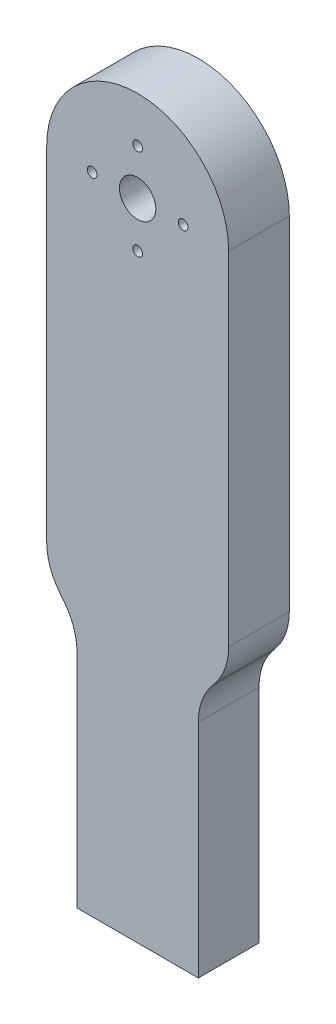
ISO-10303-21;
HEADER;
FILE_DESCRIPTION(('STEP AP214'),'2;1');
FILE_NAME('part.step','',(''),(''),'','','');
FILE_SCHEMA(('AUTOMOTIVE_DESIGN { 1 0 10303 214 1 1 1 1 }'));
ENDSEC;
DATA;
#1=APPLICATION_CONTEXT('core data for automotive mechanical design processes');
#2=APPLICATION_PROTOCOL_DEFINITION('international standard','automotive_design',2000,#1);
#3=PRODUCT_CONTEXT('',#1,'mechanical');
#4=PRODUCT('Part','Part','',(#3));
#5=PRODUCT_RELATED_PRODUCT_CATEGORY('part','',(#4));
#6=PRODUCT_DEFINITION_FORMATION('','',#4);
#7=PRODUCT_DEFINITION_CONTEXT('part definition',#1,'design');
#8=PRODUCT_DEFINITION('design','',#6,#7);
#9=PRODUCT_DEFINITION_SHAPE('','',#8);
#10=(LENGTH_UNIT() NAMED_UNIT(*) SI_UNIT(.MILLI.,.METRE.));
#11=(NAMED_UNIT(*) PLANE_ANGLE_UNIT() SI_UNIT($,.RADIAN.));
#12=(NAMED_UNIT(*) SI_UNIT($,.STERADIAN.) SOLID_ANGLE_UNIT());
#13=UNCERTAINTY_MEASURE_WITH_UNIT(LENGTH_MEASURE(1.E-05),#10,'distance_accuracy_value','');
#14=(GEOMETRIC_REPRESENTATION_CONTEXT(3) GLOBAL_UNCERTAINTY_ASSIGNED_CONTEXT((#13)) GLOBAL_UNIT_ASSIGNED_CONTEXT((#10,
#11,#12)) REPRESENTATION_CONTEXT('',''));
#15=CARTESIAN_POINT('',(0.,0.,0.));
#16=DIRECTION('',(0.,0.,1.));
#17=DIRECTION('',(1.,0.,0.));
#18=AXIS2_PLACEMENT_3D('',#15,#16,#17);
#19=CARTESIAN_POINT('',(15.,0.,5.));
#20=DIRECTION('',(1.,0.,0.));
#21=DIRECTION('',(0.,1.,0.));
#22=AXIS2_PLACEMENT_3D('',#19,#20,#21);
#23=PLANE('',#22);
#24=DIRECTION('',(0.,-1.,0.));
#25=VECTOR('',#24,1.);
#26=CARTESIAN_POINT('',(15.,0.,-5.));
#27=LINE('',#26,#25);
#28=CARTESIAN_POINT('',(15.,13.5,-5.));
#29=VERTEX_POINT('',#28);
#30=CARTESIAN_POINT('',(15.,-43.0102565672326,-5.));
#31=VERTEX_POINT('',#30);
#32=EDGE_CURVE('E187',#29,#31,#27,.T.);
#33=ORIENTED_EDGE('',*,*,#32,.F.);
#34=DIRECTION('',(0.,0.,-1.));
#35=VECTOR('',#34,1.);
#36=CARTESIAN_POINT('',(15.,13.5,5.));
#37=LINE('',#36,#35);
#38=CARTESIAN_POINT('',(15.,13.5,5.));
#39=VERTEX_POINT('',#38);
#40=EDGE_CURVE('E11',#39,#29,#37,.T.);
#41=ORIENTED_EDGE('',*,*,#40,.F.);
#42=DIRECTION('',(0.,-1.,0.));
#43=VECTOR('',#42,1.);
#44=CARTESIAN_POINT('',(15.,0.,5.));
#45=LINE('',#44,#43);
#46=CARTESIAN_POINT('',(15.,-43.0102565672326,5.));
#47=VERTEX_POINT('',#46);
#48=EDGE_CURVE('E527',#39,#47,#45,.T.);
#49=ORIENTED_EDGE('',*,*,#48,.T.);
#50=DIRECTION('',(0.,0.,-1.));
#51=VECTOR('',#50,1.);
#52=CARTESIAN_POINT('',(15.,-43.0102565672326,5.));
#53=LINE('',#52,#51);
#54=EDGE_CURVE('E63',#47,#31,#53,.T.);
#55=ORIENTED_EDGE('',*,*,#54,.T.);
#56=EDGE_LOOP('',(#33,#41,#49,#55));
#57=FACE_BOUND('',#56,.T.);
#58=ADVANCED_FACE('F45',(#57),#23,.T.);
#59=CARTESIAN_POINT('',(0.,13.5,5.));
#60=DIRECTION('',(0.,0.,-1.));
#61=DIRECTION('',(-1.,0.,0.));
#62=AXIS2_PLACEMENT_3D('',#59,#60,#61);
#63=CYLINDRICAL_SURFACE('',#62,15.);
#64=CARTESIAN_POINT('',(0.,13.5,-5.));
#65=DIRECTION('',(0.,0.,1.));
#66=DIRECTION('',(1.,0.,0.));
#67=AXIS2_PLACEMENT_3D('',#64,#65,#66);
#68=CIRCLE('',#67,15.);
#69=CARTESIAN_POINT('',(-15.,13.5,-5.));
#70=VERTEX_POINT('',#69);
#71=EDGE_CURVE('E190',#70,#29,#68,.F.);
#72=ORIENTED_EDGE('',*,*,#71,.F.);
#73=DIRECTION('',(0.,0.,-1.));
#74=VECTOR('',#73,1.);
#75=CARTESIAN_POINT('',(-15.,13.5,5.));
#76=LINE('',#75,#74);
#77=CARTESIAN_POINT('',(-15.,13.5,5.));
#78=VERTEX_POINT('',#77);
#79=EDGE_CURVE('E55',#78,#70,#76,.T.);
#80=ORIENTED_EDGE('',*,*,#79,.F.);
#81=CARTESIAN_POINT('',(0.,13.5,5.));
#82=DIRECTION('',(0.,0.,1.));
#83=DIRECTION('',(1.,0.,0.));
#84=AXIS2_PLACEMENT_3D('',#81,#82,#83);
#85=CIRCLE('',#84,15.);
#86=EDGE_CURVE('E275',#78,#39,#85,.F.);
#87=ORIENTED_EDGE('',*,*,#86,.T.);
#88=ORIENTED_EDGE('',*,*,#40,.T.);
#89=EDGE_LOOP('',(#72,#80,#87,#88));
#90=FACE_BOUND('',#89,.T.);
#91=ADVANCED_FACE('F274',(#90),#63,.T.);
#92=CARTESIAN_POINT('',(-15.,0.,5.));
#93=DIRECTION('',(1.,0.,0.));
#94=DIRECTION('',(0.,1.,0.));
#95=AXIS2_PLACEMENT_3D('',#92,#93,#94);
#96=PLANE('',#95);
#97=DIRECTION('',(0.,-1.,0.));
#98=VECTOR('',#97,1.);
#99=CARTESIAN_POINT('',(-15.,0.,-5.));
#100=LINE('',#99,#98);
#101=CARTESIAN_POINT('',(-15.,-43.0102565672326,-5.));
#102=VERTEX_POINT('',#101);
#103=EDGE_CURVE('E194',#70,#102,#100,.T.);
#104=ORIENTED_EDGE('',*,*,#103,.T.);
#105=DIRECTION('',(0.,0.,-1.));
#106=VECTOR('',#105,1.);
#107=CARTESIAN_POINT('',(-15.,-43.0102565672326,5.));
#108=LINE('',#107,#106);
#109=CARTESIAN_POINT('',(-15.,-43.0102565672326,5.));
#110=VERTEX_POINT('',#109);
#111=EDGE_CURVE('E257',#110,#102,#108,.T.);
#112=ORIENTED_EDGE('',*,*,#111,.F.);
#113=DIRECTION('',(0.,-1.,0.));
#114=VECTOR('',#113,1.);
#115=CARTESIAN_POINT('',(-15.,0.,5.));
#116=LINE('',#115,#114);
#117=EDGE_CURVE('E267',#78,#110,#116,.T.);
#118=ORIENTED_EDGE('',*,*,#117,.F.);
#119=ORIENTED_EDGE('',*,*,#79,.T.);
#120=EDGE_LOOP('',(#104,#112,#118,#119));
#121=FACE_BOUND('',#120,.T.);
#122=ADVANCED_FACE('F264',(#121),#96,.F.);
#123=CARTESIAN_POINT('',(-4.99999999999999,-43.0102565672327,5.));
#124=DIRECTION('',(0.,0.,-1.));
#125=DIRECTION('',(-1.,0.,0.));
#126=AXIS2_PLACEMENT_3D('',#123,#124,#125);
#127=CYLINDRICAL_SURFACE('',#126,10.);
#128=CARTESIAN_POINT('',(-4.99999999999999,-43.0102565672327,-5.));
#129=DIRECTION('',(0.,0.,1.));
#130=DIRECTION('',(1.,0.,0.));
#131=AXIS2_PLACEMENT_3D('',#128,#129,#130);
#132=CIRCLE('',#131,10.);
#133=CARTESIAN_POINT('',(-12.8287586413967,-49.2320359055536,-5.));
#134=VERTEX_POINT('',#133);
#135=EDGE_CURVE('E198',#102,#134,#132,.T.);
#136=ORIENTED_EDGE('',*,*,#135,.T.);
#137=DIRECTION('',(0.,0.,-1.));
#138=VECTOR('',#137,1.);
#139=CARTESIAN_POINT('',(-12.8287586413967,-49.2320359055536,5.));
#140=LINE('',#139,#138);
#141=CARTESIAN_POINT('',(-12.8287586413967,-49.2320359055536,5.));
#142=VERTEX_POINT('',#141);
#143=EDGE_CURVE('E253',#142,#134,#140,.T.);
#144=ORIENTED_EDGE('',*,*,#143,.F.);
#145=CARTESIAN_POINT('',(-4.99999999999999,-43.0102565672327,5.));
#146=DIRECTION('',(0.,0.,1.));
#147=DIRECTION('',(1.,0.,0.));
#148=AXIS2_PLACEMENT_3D('',#145,#146,#147);
#149=CIRCLE('',#148,10.);
#150=EDGE_CURVE('E519',#110,#142,#149,.T.);
#151=ORIENTED_EDGE('',*,*,#150,.F.);
#152=ORIENTED_EDGE('',*,*,#111,.T.);
#153=EDGE_LOOP('',(#136,#144,#151,#152));
#154=FACE_BOUND('',#153,.T.);
#155=ADVANCED_FACE('F449',(#154),#127,.T.);
#156=CARTESIAN_POINT('',(-31.843015353067,-25.3067215466231,5.));
#157=DIRECTION('',(0.782875864139671,0.622177933832086,0.));
#158=DIRECTION('',(-0.622177933832086,0.782875864139671,0.));
#159=AXIS2_PLACEMENT_3D('',#156,#157,#158);
#160=PLANE('',#159);
#161=DIRECTION('',(0.622177933832086,-0.782875864139671,0.));
#162=VECTOR('',#161,1.);
#163=CARTESIAN_POINT('',(-31.843015353067,-25.3067215466231,-5.));
#164=LINE('',#163,#162);
#165=CARTESIAN_POINT('',(-12.1712413586033,-50.0593786687132,-5.));
#166=VERTEX_POINT('',#165);
#167=EDGE_CURVE('E202',#134,#166,#164,.T.);
#168=ORIENTED_EDGE('',*,*,#167,.T.);
#169=DIRECTION('',(0.,0.,-1.));
#170=VECTOR('',#169,1.);
#171=CARTESIAN_POINT('',(-12.1712413586033,-50.0593786687132,5.));
#172=LINE('',#171,#170);
#173=CARTESIAN_POINT('',(-12.1712413586033,-50.0593786687132,5.));
#174=VERTEX_POINT('',#173);
#175=EDGE_CURVE('E249',#174,#166,#172,.T.);
#176=ORIENTED_EDGE('',*,*,#175,.F.);
#177=DIRECTION('',(0.622177933832086,-0.782875864139671,0.));
#178=VECTOR('',#177,1.);
#179=CARTESIAN_POINT('',(-31.843015353067,-25.3067215466231,5.));
#180=LINE('',#179,#178);
#181=EDGE_CURVE('E522',#142,#174,#180,.T.);
#182=ORIENTED_EDGE('',*,*,#181,.F.);
#183=ORIENTED_EDGE('',*,*,#143,.T.);
#184=EDGE_LOOP('',(#168,#176,#182,#183));
#185=FACE_BOUND('',#184,.T.);
#186=ADVANCED_FACE('F438',(#185),#160,.F.);
#187=CARTESIAN_POINT('',(-20.,-56.2811580070341,5.));
#188=DIRECTION('',(0.,0.,-1.));
#189=DIRECTION('',(-1.,0.,0.));
#190=AXIS2_PLACEMENT_3D('',#187,#188,#189);
#191=CYLINDRICAL_SURFACE('',#190,10.);
#192=CARTESIAN_POINT('',(-20.,-56.2811580070341,-5.));
#193=DIRECTION('',(0.,0.,1.));
#194=DIRECTION('',(1.,0.,0.));
#195=AXIS2_PLACEMENT_3D('',#192,#193,#194);
#196=CIRCLE('',#195,10.);
#197=CARTESIAN_POINT('',(-9.99999999999999,-56.2811580070342,-5.));
#198=VERTEX_POINT('',#197);
#199=EDGE_CURVE('E206',#166,#198,#196,.F.);
#200=ORIENTED_EDGE('',*,*,#199,.T.);
#201=DIRECTION('',(0.,0.,-1.));
#202=VECTOR('',#201,1.);
#203=CARTESIAN_POINT('',(-9.99999999999999,-56.2811580070342,5.));
#204=LINE('',#203,#202);
#205=CARTESIAN_POINT('',(-9.99999999999999,-56.2811580070342,5.));
#206=VERTEX_POINT('',#205);
#207=EDGE_CURVE('E245',#206,#198,#204,.T.);
#208=ORIENTED_EDGE('',*,*,#207,.F.);
#209=CARTESIAN_POINT('',(-20.,-56.2811580070341,5.));
#210=DIRECTION('',(0.,0.,1.));
#211=DIRECTION('',(1.,0.,0.));
#212=AXIS2_PLACEMENT_3D('',#209,#210,#211);
#213=CIRCLE('',#212,10.);
#214=EDGE_CURVE('E533',#174,#206,#213,.F.);
#215=ORIENTED_EDGE('',*,*,#214,.F.);
#216=ORIENTED_EDGE('',*,*,#175,.T.);
#217=EDGE_LOOP('',(#200,#208,#215,#216));
#218=FACE_BOUND('',#217,.T.);
#219=ADVANCED_FACE('F427',(#218),#191,.F.);
#220=CARTESIAN_POINT('',(-10.,0.,5.));
#221=DIRECTION('',(1.,0.,0.));
#222=DIRECTION('',(0.,1.,0.));
#223=AXIS2_PLACEMENT_3D('',#220,#221,#222);
#224=PLANE('',#223);
#225=DIRECTION('',(0.,-1.,0.));
#226=VECTOR('',#225,1.);
#227=CARTESIAN_POINT('',(-10.,0.,-5.));
#228=LINE('',#227,#226);
#229=CARTESIAN_POINT('',(-9.99999999999999,-92.7914145742668,-5.));
#230=VERTEX_POINT('',#229);
#231=EDGE_CURVE('E210',#198,#230,#228,.T.);
#232=ORIENTED_EDGE('',*,*,#231,.T.);
#233=DIRECTION('',(0.,0.,-1.));
#234=VECTOR('',#233,1.);
#235=CARTESIAN_POINT('',(-9.99999999999999,-92.7914145742668,5.));
#236=LINE('',#235,#234);
#237=CARTESIAN_POINT('',(-9.99999999999999,-92.7914145742668,5.));
#238=VERTEX_POINT('',#237);
#239=EDGE_CURVE('E241',#238,#230,#236,.T.);
#240=ORIENTED_EDGE('',*,*,#239,.F.);
#241=DIRECTION('',(0.,-1.,0.));
#242=VECTOR('',#241,1.);
#243=CARTESIAN_POINT('',(-10.,0.,5.));
#244=LINE('',#243,#242);
#245=EDGE_CURVE('E537',#206,#238,#244,.T.);
#246=ORIENTED_EDGE('',*,*,#245,.F.);
#247=ORIENTED_EDGE('',*,*,#207,.T.);
#248=EDGE_LOOP('',(#232,#240,#246,#247));
#249=FACE_BOUND('',#248,.T.);
#250=ADVANCED_FACE('F416',(#249),#224,.F.);
#251=CARTESIAN_POINT('',(0.,-92.7914145742668,5.));
#252=DIRECTION('',(0.,1.,0.));
#253=DIRECTION('',(0.,0.,1.));
#254=AXIS2_PLACEMENT_3D('',#251,#252,#253);
#255=PLANE('',#254);
#256=DIRECTION('',(1.,0.,0.));
#257=VECTOR('',#256,1.);
#258=CARTESIAN_POINT('',(0.,-92.7914145742668,-5.));
#259=LINE('',#258,#257);
#260=CARTESIAN_POINT('',(9.99999999999999,-92.7914145742668,-5.));
#261=VERTEX_POINT('',#260);
#262=EDGE_CURVE('E214',#230,#261,#259,.T.);
#263=ORIENTED_EDGE('',*,*,#262,.T.);
#264=DIRECTION('',(0.,0.,-1.));
#265=VECTOR('',#264,1.);
#266=CARTESIAN_POINT('',(9.99999999999999,-92.7914145742668,5.));
#267=LINE('',#266,#265);
#268=CARTESIAN_POINT('',(9.99999999999999,-92.7914145742668,5.));
#269=VERTEX_POINT('',#268);
#270=EDGE_CURVE('E238',#269,#261,#267,.T.);
#271=ORIENTED_EDGE('',*,*,#270,.F.);
#272=DIRECTION('',(1.,0.,0.));
#273=VECTOR('',#272,1.);
#274=CARTESIAN_POINT('',(0.,-92.7914145742668,5.));
#275=LINE('',#274,#273);
#276=EDGE_CURVE('E541',#238,#269,#275,.T.);
#277=ORIENTED_EDGE('',*,*,#276,.F.);
#278=ORIENTED_EDGE('',*,*,#239,.T.);
#279=EDGE_LOOP('',(#263,#271,#277,#278));
#280=FACE_BOUND('',#279,.T.);
#281=ADVANCED_FACE('F405',(#280),#255,.F.);
#282=CARTESIAN_POINT('',(10.,0.,5.));
#283=DIRECTION('',(1.,0.,0.));
#284=DIRECTION('',(0.,1.,0.));
#285=AXIS2_PLACEMENT_3D('',#282,#283,#284);
#286=PLANE('',#285);
#287=DIRECTION('',(0.,-1.,0.));
#288=VECTOR('',#287,1.);
#289=CARTESIAN_POINT('',(10.,0.,-5.));
#290=LINE('',#289,#288);
#291=CARTESIAN_POINT('',(9.99999999999999,-56.2811580070342,-5.));
#292=VERTEX_POINT('',#291);
#293=EDGE_CURVE('E218',#292,#261,#290,.T.);
#294=ORIENTED_EDGE('',*,*,#293,.F.);
#295=DIRECTION('',(0.,0.,-1.));
#296=VECTOR('',#295,1.);
#297=CARTESIAN_POINT('',(9.99999999999999,-56.2811580070342,5.));
#298=LINE('',#297,#296);
#299=CARTESIAN_POINT('',(9.99999999999999,-56.2811580070342,5.));
#300=VERTEX_POINT('',#299);
#301=EDGE_CURVE('E157',#300,#292,#298,.T.);
#302=ORIENTED_EDGE('',*,*,#301,.F.);
#303=DIRECTION('',(0.,-1.,0.));
#304=VECTOR('',#303,1.);
#305=CARTESIAN_POINT('',(10.,0.,5.));
#306=LINE('',#305,#304);
#307=EDGE_CURVE('E145',#300,#269,#306,.T.);
#308=ORIENTED_EDGE('',*,*,#307,.T.);
#309=ORIENTED_EDGE('',*,*,#270,.T.);
#310=EDGE_LOOP('',(#294,#302,#308,#309));
#311=FACE_BOUND('',#310,.T.);
#312=ADVANCED_FACE('F395',(#311),#286,.T.);
#313=CARTESIAN_POINT('',(20.,-56.2811580070341,5.));
#314=DIRECTION('',(0.,0.,-1.));
#315=DIRECTION('',(-1.,0.,0.));
#316=AXIS2_PLACEMENT_3D('',#313,#314,#315);
#317=CYLINDRICAL_SURFACE('',#316,10.);
#318=CARTESIAN_POINT('',(20.,-56.2811580070341,-5.));
#319=DIRECTION('',(0.,0.,1.));
#320=DIRECTION('',(1.,0.,0.));
#321=AXIS2_PLACEMENT_3D('',#318,#319,#320);
#322=CIRCLE('',#321,10.);
#323=CARTESIAN_POINT('',(12.1712413586033,-50.0593786687132,-5.));
#324=VERTEX_POINT('',#323);
#325=EDGE_CURVE('E153',#292,#324,#322,.F.);
#326=ORIENTED_EDGE('',*,*,#325,.T.);
#327=DIRECTION('',(0.,0.,-1.));
#328=VECTOR('',#327,1.);
#329=CARTESIAN_POINT('',(12.1712413586033,-50.0593786687132,5.));
#330=LINE('',#329,#328);
#331=CARTESIAN_POINT('',(12.1712413586033,-50.0593786687132,5.));
#332=VERTEX_POINT('',#331);
#333=EDGE_CURVE('E150',#332,#324,#330,.T.);
#334=ORIENTED_EDGE('',*,*,#333,.F.);
#335=CARTESIAN_POINT('',(20.,-56.2811580070341,5.));
#336=DIRECTION('',(0.,0.,1.));
#337=DIRECTION('',(1.,0.,0.));
#338=AXIS2_PLACEMENT_3D('',#335,#336,#337);
#339=CIRCLE('',#338,10.);
#340=EDGE_CURVE('E138',#300,#332,#339,.F.);
#341=ORIENTED_EDGE('',*,*,#340,.F.);
#342=ORIENTED_EDGE('',*,*,#301,.T.);
#343=EDGE_LOOP('',(#326,#334,#341,#342));
#344=FACE_BOUND('',#343,.T.);
#345=ADVANCED_FACE('F151',(#344),#317,.F.);
#346=CARTESIAN_POINT('',(31.843015353067,-25.3067215466231,5.));
#347=DIRECTION('',(0.782875864139671,-0.622177933832086,0.));
#348=DIRECTION('',(0.622177933832086,0.782875864139671,0.));
#349=AXIS2_PLACEMENT_3D('',#346,#347,#348);
#350=PLANE('',#349);
#351=DIRECTION('',(-0.622177933832086,-0.782875864139671,0.));
#352=VECTOR('',#351,1.);
#353=CARTESIAN_POINT('',(31.843015353067,-25.3067215466231,-5.));
#354=LINE('',#353,#352);
#355=CARTESIAN_POINT('',(12.8287586413967,-49.2320359055536,-5.));
#356=VERTEX_POINT('',#355);
#357=EDGE_CURVE('E224',#356,#324,#354,.T.);
#358=ORIENTED_EDGE('',*,*,#357,.F.);
#359=DIRECTION('',(0.,0.,-1.));
#360=VECTOR('',#359,1.);
#361=CARTESIAN_POINT('',(12.8287586413967,-49.2320359055536,5.));
#362=LINE('',#361,#360);
#363=CARTESIAN_POINT('',(12.8287586413967,-49.2320359055536,5.));
#364=VERTEX_POINT('',#363);
#365=EDGE_CURVE('E100',#364,#356,#362,.T.);
#366=ORIENTED_EDGE('',*,*,#365,.F.);
#367=DIRECTION('',(-0.622177933832086,-0.782875864139671,0.));
#368=VECTOR('',#367,1.);
#369=CARTESIAN_POINT('',(31.843015353067,-25.3067215466231,5.));
#370=LINE('',#369,#368);
#371=EDGE_CURVE('E143',#364,#332,#370,.T.);
#372=ORIENTED_EDGE('',*,*,#371,.T.);
#373=ORIENTED_EDGE('',*,*,#333,.T.);
#374=EDGE_LOOP('',(#358,#366,#372,#373));
#375=FACE_BOUND('',#374,.T.);
#376=ADVANCED_FACE('F159',(#375),#350,.T.);
#377=CARTESIAN_POINT('',(-7.50527026804412,13.4987548054156,5.));
#378=DIRECTION('',(0.,0.,-1.));
#379=DIRECTION('',(-1.,0.,0.));
#380=AXIS2_PLACEMENT_3D('',#377,#378,#379);
#381=CYLINDRICAL_SURFACE('',#380,0.8);
#382=CARTESIAN_POINT('',(-7.50527026804412,13.4987548054156,5.));
#383=DIRECTION('',(0.,0.,1.));
#384=DIRECTION('',(1.,0.,0.));
#385=AXIS2_PLACEMENT_3D('',#382,#383,#384);
#386=CIRCLE('',#385,0.8);
#387=CARTESIAN_POINT('',(-6.70527026804412,13.4987548054156,5.));
#388=VERTEX_POINT('',#387);
#389=EDGE_CURVE('E551',#388,#388,#386,.T.);
#390=ORIENTED_EDGE('',*,*,#389,.T.);
#391=EDGE_LOOP('',(#390));
#392=FACE_BOUND('',#391,.T.);
#393=CARTESIAN_POINT('',(-7.50527026804412,13.4987548054156,-5.));
#394=DIRECTION('',(0.,0.,1.));
#395=DIRECTION('',(1.,0.,0.));
#396=AXIS2_PLACEMENT_3D('',#393,#394,#395);
#397=CIRCLE('',#396,0.8);
#398=CARTESIAN_POINT('',(-6.70527026804412,13.4987548054156,-5.));
#399=VERTEX_POINT('',#398);
#400=EDGE_CURVE('E183',#399,#399,#397,.T.);
#401=ORIENTED_EDGE('',*,*,#400,.F.);
#402=EDGE_LOOP('',(#401));
#403=FACE_BOUND('',#402,.T.);
#404=ADVANCED_FACE('F297',(#392,#403),#381,.F.);
#405=CARTESIAN_POINT('',(-0.00527026804411678,5.99875480541562,5.));
#406=DIRECTION('',(0.,0.,-1.));
#407=DIRECTION('',(-1.,0.,0.));
#408=AXIS2_PLACEMENT_3D('',#405,#406,#407);
#409=CYLINDRICAL_SURFACE('',#408,0.8);
#410=CARTESIAN_POINT('',(-0.00527026804411678,5.99875480541562,5.));
#411=DIRECTION('',(0.,0.,1.));
#412=DIRECTION('',(1.,0.,0.));
#413=AXIS2_PLACEMENT_3D('',#410,#411,#412);
#414=CIRCLE('',#413,0.8);
#415=CARTESIAN_POINT('',(0.794729731955883,5.99875480541562,5.));
#416=VERTEX_POINT('',#415);
#417=EDGE_CURVE('E555',#416,#416,#414,.T.);
#418=ORIENTED_EDGE('',*,*,#417,.T.);
#419=EDGE_LOOP('',(#418));
#420=FACE_BOUND('',#419,.T.);
#421=CARTESIAN_POINT('',(-0.00527026804411678,5.99875480541562,-5.));
#422=DIRECTION('',(0.,0.,1.));
#423=DIRECTION('',(1.,0.,0.));
#424=AXIS2_PLACEMENT_3D('',#421,#422,#423);
#425=CIRCLE('',#424,0.8);
#426=CARTESIAN_POINT('',(0.794729731955883,5.99875480541562,-5.));
#427=VERTEX_POINT('',#426);
#428=EDGE_CURVE('E179',#427,#427,#425,.T.);
#429=ORIENTED_EDGE('',*,*,#428,.F.);
#430=EDGE_LOOP('',(#429));
#431=FACE_BOUND('',#430,.T.);
#432=ADVANCED_FACE('F300',(#420,#431),#409,.F.);
#433=CARTESIAN_POINT('',(7.49472973195588,13.4987548054155,5.));
#434=DIRECTION('',(0.,0.,-1.));
#435=DIRECTION('',(-1.,0.,0.));
#436=AXIS2_PLACEMENT_3D('',#433,#434,#435);
#437=CYLINDRICAL_SURFACE('',#436,0.8);
#438=CARTESIAN_POINT('',(7.49472973195588,13.4987548054155,5.));
#439=DIRECTION('',(0.,0.,1.));
#440=DIRECTION('',(1.,0.,0.));
#441=AXIS2_PLACEMENT_3D('',#438,#439,#440);
#442=CIRCLE('',#441,0.8);
#443=CARTESIAN_POINT('',(8.29472973195588,13.4987548054155,5.));
#444=VERTEX_POINT('',#443);
#445=EDGE_CURVE('E559',#444,#444,#442,.T.);
#446=ORIENTED_EDGE('',*,*,#445,.T.);
#447=EDGE_LOOP('',(#446));
#448=FACE_BOUND('',#447,.T.);
#449=CARTESIAN_POINT('',(7.49472973195588,13.4987548054155,-5.));
#450=DIRECTION('',(0.,0.,1.));
#451=DIRECTION('',(1.,0.,0.));
#452=AXIS2_PLACEMENT_3D('',#449,#450,#451);
#453=CIRCLE('',#452,0.8);
#454=CARTESIAN_POINT('',(8.29472973195588,13.4987548054155,-5.));
#455=VERTEX_POINT('',#454);
#456=EDGE_CURVE('E175',#455,#455,#453,.T.);
#457=ORIENTED_EDGE('',*,*,#456,.F.);
#458=EDGE_LOOP('',(#457));
#459=FACE_BOUND('',#458,.T.);
#460=ADVANCED_FACE('F304',(#448,#459),#437,.F.);
#461=CARTESIAN_POINT('',(-0.00527026804406441,20.9987548054156,5.));
#462=DIRECTION('',(0.,0.,-1.));
#463=DIRECTION('',(-1.,0.,0.));
#464=AXIS2_PLACEMENT_3D('',#461,#462,#463);
#465=CYLINDRICAL_SURFACE('',#464,0.8);
#466=CARTESIAN_POINT('',(-0.00527026804406441,20.9987548054156,5.));
#467=DIRECTION('',(0.,0.,1.));
#468=DIRECTION('',(1.,0.,0.));
#469=AXIS2_PLACEMENT_3D('',#466,#467,#468);
#470=CIRCLE('',#469,0.8);
#471=CARTESIAN_POINT('',(0.794729731955936,20.9987548054156,5.));
#472=VERTEX_POINT('',#471);
#473=EDGE_CURVE('E315',#472,#472,#470,.T.);
#474=ORIENTED_EDGE('',*,*,#473,.T.);
#475=EDGE_LOOP('',(#474));
#476=FACE_BOUND('',#475,.T.);
#477=CARTESIAN_POINT('',(-0.00527026804406441,20.9987548054156,-5.));
#478=DIRECTION('',(0.,0.,1.));
#479=DIRECTION('',(1.,0.,0.));
#480=AXIS2_PLACEMENT_3D('',#477,#478,#479);
#481=CIRCLE('',#480,0.8);
#482=CARTESIAN_POINT('',(0.794729731955936,20.9987548054156,-5.));
#483=VERTEX_POINT('',#482);
#484=EDGE_CURVE('E171',#483,#483,#481,.T.);
#485=ORIENTED_EDGE('',*,*,#484,.F.);
#486=EDGE_LOOP('',(#485));
#487=FACE_BOUND('',#486,.T.);
#488=ADVANCED_FACE('F285',(#476,#487),#465,.F.);
#489=CARTESIAN_POINT('',(-0.00527026804411678,13.4987548054156,5.));
#490=DIRECTION('',(0.,0.,-1.));
#491=DIRECTION('',(-1.,0.,0.));
#492=AXIS2_PLACEMENT_3D('',#489,#490,#491);
#493=CYLINDRICAL_SURFACE('',#492,3.);
#494=CARTESIAN_POINT('',(-0.00527026804411678,13.4987548054156,5.));
#495=DIRECTION('',(0.,0.,1.));
#496=DIRECTION('',(1.,0.,0.));
#497=AXIS2_PLACEMENT_3D('',#494,#495,#496);
#498=CIRCLE('',#497,3.);
#499=CARTESIAN_POINT('',(2.99472973195588,13.4987548054156,5.));
#500=VERTEX_POINT('',#499);
#501=EDGE_CURVE('E231',#500,#500,#498,.T.);
#502=ORIENTED_EDGE('',*,*,#501,.T.);
#503=EDGE_LOOP('',(#502));
#504=FACE_BOUND('',#503,.T.);
#505=CARTESIAN_POINT('',(-0.00527026804411678,13.4987548054156,-5.));
#506=DIRECTION('',(0.,0.,1.));
#507=DIRECTION('',(1.,0.,0.));
#508=AXIS2_PLACEMENT_3D('',#505,#506,#507);
#509=CIRCLE('',#508,3.);
#510=CARTESIAN_POINT('',(2.99472973195588,13.4987548054156,-5.));
#511=VERTEX_POINT('',#510);
#512=EDGE_CURVE('E167',#511,#511,#509,.T.);
#513=ORIENTED_EDGE('',*,*,#512,.F.);
#514=EDGE_LOOP('',(#513));
#515=FACE_BOUND('',#514,.T.);
#516=ADVANCED_FACE('F47',(#504,#515),#493,.F.);
#517=CARTESIAN_POINT('',(4.99999999999998,-43.0102565672327,5.));
#518=DIRECTION('',(0.,0.,-1.));
#519=DIRECTION('',(-1.,0.,0.));
#520=AXIS2_PLACEMENT_3D('',#517,#518,#519);
#521=CYLINDRICAL_SURFACE('',#520,10.);
#522=CARTESIAN_POINT('',(4.99999999999998,-43.0102565672327,-5.));
#523=DIRECTION('',(0.,0.,1.));
#524=DIRECTION('',(1.,0.,0.));
#525=AXIS2_PLACEMENT_3D('',#522,#523,#524);
#526=CIRCLE('',#525,10.);
#527=EDGE_CURVE('E227',#31,#356,#526,.F.);
#528=ORIENTED_EDGE('',*,*,#527,.F.);
#529=ORIENTED_EDGE('',*,*,#54,.F.);
#530=CARTESIAN_POINT('',(4.99999999999998,-43.0102565672327,5.));
#531=DIRECTION('',(0.,0.,1.));
#532=DIRECTION('',(1.,0.,0.));
#533=AXIS2_PLACEMENT_3D('',#530,#531,#532);
#534=CIRCLE('',#533,10.);
#535=EDGE_CURVE('E161',#47,#364,#534,.F.);
#536=ORIENTED_EDGE('',*,*,#535,.T.);
#537=ORIENTED_EDGE('',*,*,#365,.T.);
#538=EDGE_LOOP('',(#528,#529,#536,#537));
#539=FACE_BOUND('',#538,.T.);
#540=ADVANCED_FACE('F276',(#539),#521,.T.);
#541=CARTESIAN_POINT('',(0.,0.,5.));
#542=DIRECTION('',(0.,0.,1.));
#543=DIRECTION('',(1.,0.,0.));
#544=AXIS2_PLACEMENT_3D('',#541,#542,#543);
#545=PLANE('',#544);
#546=ORIENTED_EDGE('',*,*,#501,.F.);
#547=EDGE_LOOP('',(#546));
#548=FACE_BOUND('',#547,.T.);
#549=ORIENTED_EDGE('',*,*,#473,.F.);
#550=EDGE_LOOP('',(#549));
#551=FACE_BOUND('',#550,.T.);
#552=ORIENTED_EDGE('',*,*,#445,.F.);
#553=EDGE_LOOP('',(#552));
#554=FACE_BOUND('',#553,.T.);
#555=ORIENTED_EDGE('',*,*,#417,.F.);
#556=EDGE_LOOP('',(#555));
#557=FACE_BOUND('',#556,.T.);
#558=ORIENTED_EDGE('',*,*,#389,.F.);
#559=EDGE_LOOP('',(#558));
#560=FACE_BOUND('',#559,.T.);
#561=ORIENTED_EDGE('',*,*,#48,.F.);
#562=ORIENTED_EDGE('',*,*,#86,.F.);
#563=ORIENTED_EDGE('',*,*,#117,.T.);
#564=ORIENTED_EDGE('',*,*,#150,.T.);
#565=ORIENTED_EDGE('',*,*,#181,.T.);
#566=ORIENTED_EDGE('',*,*,#214,.T.);
#567=ORIENTED_EDGE('',*,*,#245,.T.);
#568=ORIENTED_EDGE('',*,*,#276,.T.);
#569=ORIENTED_EDGE('',*,*,#307,.F.);
#570=ORIENTED_EDGE('',*,*,#340,.T.);
#571=ORIENTED_EDGE('',*,*,#371,.F.);
#572=ORIENTED_EDGE('',*,*,#535,.F.);
#573=EDGE_LOOP('',(#561,#562,#563,#564,#565,#566,#567,#568,#569,#570,#571,#572));
#574=FACE_BOUND('',#573,.T.);
#575=ADVANCED_FACE('F140',(#548,#551,#554,#557,#560,#574),#545,.T.);
#576=CARTESIAN_POINT('',(0.,0.,-5.));
#577=DIRECTION('',(0.,0.,1.));
#578=DIRECTION('',(1.,0.,0.));
#579=AXIS2_PLACEMENT_3D('',#576,#577,#578);
#580=PLANE('',#579);
#581=ORIENTED_EDGE('',*,*,#512,.T.);
#582=EDGE_LOOP('',(#581));
#583=FACE_BOUND('',#582,.T.);
#584=ORIENTED_EDGE('',*,*,#484,.T.);
#585=EDGE_LOOP('',(#584));
#586=FACE_BOUND('',#585,.T.);
#587=ORIENTED_EDGE('',*,*,#456,.T.);
#588=EDGE_LOOP('',(#587));
#589=FACE_BOUND('',#588,.T.);
#590=ORIENTED_EDGE('',*,*,#428,.T.);
#591=EDGE_LOOP('',(#590));
#592=FACE_BOUND('',#591,.T.);
#593=ORIENTED_EDGE('',*,*,#400,.T.);
#594=EDGE_LOOP('',(#593));
#595=FACE_BOUND('',#594,.T.);
#596=ORIENTED_EDGE('',*,*,#32,.T.);
#597=ORIENTED_EDGE('',*,*,#527,.T.);
#598=ORIENTED_EDGE('',*,*,#357,.T.);
#599=ORIENTED_EDGE('',*,*,#325,.F.);
#600=ORIENTED_EDGE('',*,*,#293,.T.);
#601=ORIENTED_EDGE('',*,*,#262,.F.);
#602=ORIENTED_EDGE('',*,*,#231,.F.);
#603=ORIENTED_EDGE('',*,*,#199,.F.);
#604=ORIENTED_EDGE('',*,*,#167,.F.);
#605=ORIENTED_EDGE('',*,*,#135,.F.);
#606=ORIENTED_EDGE('',*,*,#103,.F.);
#607=ORIENTED_EDGE('',*,*,#71,.T.);
#608=EDGE_LOOP('',(#596,#597,#598,#599,#600,#601,#602,#603,#604,#605,#606,#607));
#609=FACE_BOUND('',#608,.T.);
#610=ADVANCED_FACE('F273',(#583,#586,#589,#592,#595,#609),#580,.F.);
#611=CLOSED_SHELL('',(#58,#91,#122,#155,#186,#219,#250,#281,#312,#345,#376,#404,#432,#460,#488,
#516,#540,#575,#610));
#612=MANIFOLD_SOLID_BREP('B2',#611);
#613=ADVANCED_BREP_SHAPE_REPRESENTATION('',(#18,#612),#14);
#614=SHAPE_DEFINITION_REPRESENTATION(#9,#613);
ENDSEC;
END-ISO-10303-21;
